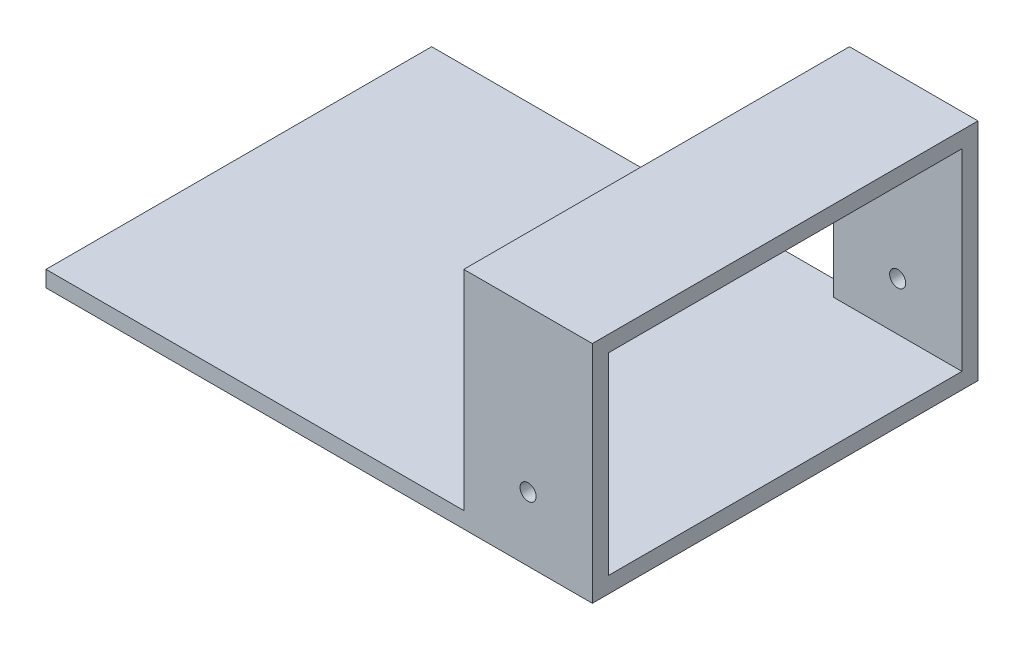
ISO-10303-21;
HEADER;
FILE_DESCRIPTION(('STEP AP214'),'2;1');
FILE_NAME('part.step','',(''),(''),'','','');
FILE_SCHEMA(('AUTOMOTIVE_DESIGN { 1 0 10303 214 1 1 1 1 }'));
ENDSEC;
DATA;
#1=APPLICATION_CONTEXT('core data for automotive mechanical design processes');
#2=APPLICATION_PROTOCOL_DEFINITION('international standard','automotive_design',2000,#1);
#3=PRODUCT_CONTEXT('',#1,'mechanical');
#4=PRODUCT('Part','Part','',(#3));
#5=PRODUCT_RELATED_PRODUCT_CATEGORY('part','',(#4));
#6=PRODUCT_DEFINITION_FORMATION('','',#4);
#7=PRODUCT_DEFINITION_CONTEXT('part definition',#1,'design');
#8=PRODUCT_DEFINITION('design','',#6,#7);
#9=PRODUCT_DEFINITION_SHAPE('','',#8);
#10=(LENGTH_UNIT() NAMED_UNIT(*) SI_UNIT(.MILLI.,.METRE.));
#11=(NAMED_UNIT(*) PLANE_ANGLE_UNIT() SI_UNIT($,.RADIAN.));
#12=(NAMED_UNIT(*) SI_UNIT($,.STERADIAN.) SOLID_ANGLE_UNIT());
#13=UNCERTAINTY_MEASURE_WITH_UNIT(LENGTH_MEASURE(1.E-05),#10,'distance_accuracy_value','');
#14=(GEOMETRIC_REPRESENTATION_CONTEXT(3) GLOBAL_UNCERTAINTY_ASSIGNED_CONTEXT((#13)) GLOBAL_UNIT_ASSIGNED_CONTEXT((#10,
#11,#12)) REPRESENTATION_CONTEXT('',''));
#15=CARTESIAN_POINT('',(0.,0.,0.));
#16=DIRECTION('',(0.,0.,1.));
#17=DIRECTION('',(1.,0.,0.));
#18=AXIS2_PLACEMENT_3D('',#15,#16,#17);
#19=CARTESIAN_POINT('',(-215.9,6.35,0.));
#20=DIRECTION('',(1.,0.,0.));
#21=DIRECTION('',(0.,0.,-1.));
#22=AXIS2_PLACEMENT_3D('',#19,#20,#21);
#23=PLANE('',#22);
#24=DIRECTION('',(0.,0.,1.));
#25=VECTOR('',#24,1.);
#26=CARTESIAN_POINT('',(-215.9,0.,0.));
#27=LINE('',#26,#25);
#28=CARTESIAN_POINT('',(-215.9,0.,-152.4));
#29=VERTEX_POINT('',#28);
#30=CARTESIAN_POINT('',(-215.9,0.,0.));
#31=VERTEX_POINT('',#30);
#32=EDGE_CURVE('E202',#29,#31,#27,.T.);
#33=ORIENTED_EDGE('',*,*,#32,.T.);
#34=DIRECTION('',(0.,-1.,0.));
#35=VECTOR('',#34,1.);
#36=CARTESIAN_POINT('',(-215.9,6.35,0.));
#37=LINE('',#36,#35);
#38=CARTESIAN_POINT('',(-215.9,6.35,0.));
#39=VERTEX_POINT('',#38);
#40=EDGE_CURVE('E11',#39,#31,#37,.T.);
#41=ORIENTED_EDGE('',*,*,#40,.F.);
#42=DIRECTION('',(0.,0.,1.));
#43=VECTOR('',#42,1.);
#44=CARTESIAN_POINT('',(-215.9,6.35,0.));
#45=LINE('',#44,#43);
#46=CARTESIAN_POINT('',(-215.9,6.35,-152.4));
#47=VERTEX_POINT('',#46);
#48=EDGE_CURVE('E203',#47,#39,#45,.T.);
#49=ORIENTED_EDGE('',*,*,#48,.F.);
#50=DIRECTION('',(0.,-1.,0.));
#51=VECTOR('',#50,1.);
#52=CARTESIAN_POINT('',(-215.9,6.35,-152.4));
#53=LINE('',#52,#51);
#54=EDGE_CURVE('E50',#47,#29,#53,.T.);
#55=ORIENTED_EDGE('',*,*,#54,.T.);
#56=EDGE_LOOP('',(#33,#41,#49,#55));
#57=FACE_BOUND('',#56,.T.);
#58=ADVANCED_FACE('F41',(#57),#23,.F.);
#59=CARTESIAN_POINT('',(0.,6.35,0.));
#60=DIRECTION('',(0.,0.,-1.));
#61=DIRECTION('',(-1.,0.,0.));
#62=AXIS2_PLACEMENT_3D('',#59,#60,#61);
#63=PLANE('',#62);
#64=CARTESIAN_POINT('',(-25.4,25.4,0.));
#65=DIRECTION('',(0.,0.,-1.));
#66=DIRECTION('',(-1.,0.,0.));
#67=AXIS2_PLACEMENT_3D('',#64,#65,#66);
#68=CIRCLE('',#67,3.17499999999996);
#69=CARTESIAN_POINT('',(-28.575,25.4,0.));
#70=VERTEX_POINT('',#69);
#71=EDGE_CURVE('E363',#70,#70,#68,.T.);
#72=ORIENTED_EDGE('',*,*,#71,.T.);
#73=EDGE_LOOP('',(#72));
#74=FACE_BOUND('',#73,.T.);
#75=DIRECTION('',(1.,0.,0.));
#76=VECTOR('',#75,1.);
#77=CARTESIAN_POINT('',(0.,0.,0.));
#78=LINE('',#77,#76);
#79=CARTESIAN_POINT('',(0.,0.,0.));
#80=VERTEX_POINT('',#79);
#81=EDGE_CURVE('E221',#31,#80,#78,.T.);
#82=ORIENTED_EDGE('',*,*,#81,.T.);
#83=DIRECTION('',(0.,-1.,0.));
#84=VECTOR('',#83,1.);
#85=CARTESIAN_POINT('',(0.,88.9,0.));
#86=LINE('',#85,#84);
#87=CARTESIAN_POINT('',(0.,88.9,0.));
#88=VERTEX_POINT('',#87);
#89=EDGE_CURVE('E194',#88,#80,#86,.T.);
#90=ORIENTED_EDGE('',*,*,#89,.F.);
#91=DIRECTION('',(-1.,0.,0.));
#92=VECTOR('',#91,1.);
#93=CARTESIAN_POINT('',(0.,88.9,0.));
#94=LINE('',#93,#92);
#95=CARTESIAN_POINT('',(-50.8,88.9,0.));
#96=VERTEX_POINT('',#95);
#97=EDGE_CURVE('E173',#88,#96,#94,.T.);
#98=ORIENTED_EDGE('',*,*,#97,.T.);
#99=DIRECTION('',(0.,-1.,0.));
#100=VECTOR('',#99,1.);
#101=CARTESIAN_POINT('',(-50.8,88.9,0.));
#102=LINE('',#101,#100);
#103=CARTESIAN_POINT('',(-50.8,6.34999999999999,0.));
#104=VERTEX_POINT('',#103);
#105=EDGE_CURVE('E198',#96,#104,#102,.T.);
#106=ORIENTED_EDGE('',*,*,#105,.T.);
#107=DIRECTION('',(1.,0.,0.));
#108=VECTOR('',#107,1.);
#109=CARTESIAN_POINT('',(0.,6.35,0.));
#110=LINE('',#109,#108);
#111=EDGE_CURVE('E206',#39,#104,#110,.T.);
#112=ORIENTED_EDGE('',*,*,#111,.F.);
#113=ORIENTED_EDGE('',*,*,#40,.T.);
#114=EDGE_LOOP('',(#82,#90,#98,#106,#112,#113));
#115=FACE_BOUND('',#114,.T.);
#116=ADVANCED_FACE('F239',(#74,#115),#63,.F.);
#117=CARTESIAN_POINT('',(0.,6.35,-152.4));
#118=DIRECTION('',(0.,0.,1.));
#119=DIRECTION('',(1.,0.,0.));
#120=AXIS2_PLACEMENT_3D('',#117,#118,#119);
#121=PLANE('',#120);
#122=CARTESIAN_POINT('',(-25.4,25.4,-152.4));
#123=DIRECTION('',(0.,0.,-1.));
#124=DIRECTION('',(-1.,0.,0.));
#125=AXIS2_PLACEMENT_3D('',#122,#123,#124);
#126=CIRCLE('',#125,3.17499999999998);
#127=CARTESIAN_POINT('',(-28.575,25.4,-152.4));
#128=VERTEX_POINT('',#127);
#129=EDGE_CURVE('E357',#128,#128,#126,.T.);
#130=ORIENTED_EDGE('',*,*,#129,.F.);
#131=EDGE_LOOP('',(#130));
#132=FACE_BOUND('',#131,.T.);
#133=DIRECTION('',(-1.,0.,0.));
#134=VECTOR('',#133,1.);
#135=CARTESIAN_POINT('',(0.,0.,-152.4));
#136=LINE('',#135,#134);
#137=CARTESIAN_POINT('',(0.,0.,-152.4));
#138=VERTEX_POINT('',#137);
#139=EDGE_CURVE('E207',#138,#29,#136,.T.);
#140=ORIENTED_EDGE('',*,*,#139,.T.);
#141=ORIENTED_EDGE('',*,*,#54,.F.);
#142=DIRECTION('',(-1.,0.,0.));
#143=VECTOR('',#142,1.);
#144=CARTESIAN_POINT('',(0.,6.35,-152.4));
#145=LINE('',#144,#143);
#146=CARTESIAN_POINT('',(-50.8,6.35,-152.4));
#147=VERTEX_POINT('',#146);
#148=EDGE_CURVE('E215',#147,#47,#145,.T.);
#149=ORIENTED_EDGE('',*,*,#148,.F.);
#150=DIRECTION('',(0.,-1.,0.));
#151=VECTOR('',#150,1.);
#152=CARTESIAN_POINT('',(-50.8,88.9,-152.4));
#153=LINE('',#152,#151);
#154=CARTESIAN_POINT('',(-50.8,88.9,-152.4));
#155=VERTEX_POINT('',#154);
#156=EDGE_CURVE('E183',#155,#147,#153,.T.);
#157=ORIENTED_EDGE('',*,*,#156,.F.);
#158=DIRECTION('',(-1.,0.,0.));
#159=VECTOR('',#158,1.);
#160=CARTESIAN_POINT('',(0.,88.9,-152.4));
#161=LINE('',#160,#159);
#162=CARTESIAN_POINT('',(0.,88.9,-152.4));
#163=VERTEX_POINT('',#162);
#164=EDGE_CURVE('E180',#163,#155,#161,.T.);
#165=ORIENTED_EDGE('',*,*,#164,.F.);
#166=DIRECTION('',(0.,-1.,0.));
#167=VECTOR('',#166,1.);
#168=CARTESIAN_POINT('',(0.,88.9,-152.4));
#169=LINE('',#168,#167);
#170=EDGE_CURVE('E190',#163,#138,#169,.T.);
#171=ORIENTED_EDGE('',*,*,#170,.T.);
#172=EDGE_LOOP('',(#140,#141,#149,#157,#165,#171));
#173=FACE_BOUND('',#172,.T.);
#174=ADVANCED_FACE('F241',(#132,#173),#121,.F.);
#175=CARTESIAN_POINT('',(0.,6.35,0.));
#176=DIRECTION('',(0.,1.,0.));
#177=DIRECTION('',(0.,0.,1.));
#178=AXIS2_PLACEMENT_3D('',#175,#176,#177);
#179=PLANE('',#178);
#180=ORIENTED_EDGE('',*,*,#48,.T.);
#181=ORIENTED_EDGE('',*,*,#111,.T.);
#182=DIRECTION('',(0.,0.,-1.));
#183=VECTOR('',#182,1.);
#184=CARTESIAN_POINT('',(-50.8,6.35,0.));
#185=LINE('',#184,#183);
#186=CARTESIAN_POINT('',(-50.8,6.35,-6.34999999999999));
#187=VERTEX_POINT('',#186);
#188=EDGE_CURVE('E212',#104,#187,#185,.T.);
#189=ORIENTED_EDGE('',*,*,#188,.T.);
#190=DIRECTION('',(-1.,0.,0.));
#191=VECTOR('',#190,1.);
#192=CARTESIAN_POINT('',(0.,6.35,-6.34999999999999));
#193=LINE('',#192,#191);
#194=CARTESIAN_POINT('',(0.,6.34999999999999,-6.34999999999999));
#195=VERTEX_POINT('',#194);
#196=EDGE_CURVE('E126',#195,#187,#193,.T.);
#197=ORIENTED_EDGE('',*,*,#196,.F.);
#198=DIRECTION('',(0.,0.,1.));
#199=VECTOR('',#198,1.);
#200=CARTESIAN_POINT('',(0.,6.35,-146.05));
#201=LINE('',#200,#199);
#202=CARTESIAN_POINT('',(0.,6.35,-146.05));
#203=VERTEX_POINT('',#202);
#204=EDGE_CURVE('E130',#203,#195,#201,.T.);
#205=ORIENTED_EDGE('',*,*,#204,.F.);
#206=DIRECTION('',(-1.,0.,0.));
#207=VECTOR('',#206,1.);
#208=CARTESIAN_POINT('',(0.,6.35,-146.05));
#209=LINE('',#208,#207);
#210=CARTESIAN_POINT('',(-50.8,6.35,-146.05));
#211=VERTEX_POINT('',#210);
#212=EDGE_CURVE('E117',#203,#211,#209,.T.);
#213=ORIENTED_EDGE('',*,*,#212,.T.);
#214=EDGE_CURVE('E211',#211,#147,#185,.T.);
#215=ORIENTED_EDGE('',*,*,#214,.T.);
#216=ORIENTED_EDGE('',*,*,#148,.T.);
#217=EDGE_LOOP('',(#180,#181,#189,#197,#205,#213,#215,#216));
#218=FACE_BOUND('',#217,.T.);
#219=ADVANCED_FACE('F132',(#218),#179,.T.);
#220=CARTESIAN_POINT('',(0.,0.,0.));
#221=DIRECTION('',(0.,1.,0.));
#222=DIRECTION('',(0.,0.,1.));
#223=AXIS2_PLACEMENT_3D('',#220,#221,#222);
#224=PLANE('',#223);
#225=ORIENTED_EDGE('',*,*,#32,.F.);
#226=ORIENTED_EDGE('',*,*,#139,.F.);
#227=DIRECTION('',(0.,0.,-1.));
#228=VECTOR('',#227,1.);
#229=CARTESIAN_POINT('',(0.,0.,0.));
#230=LINE('',#229,#228);
#231=EDGE_CURVE('E163',#80,#138,#230,.T.);
#232=ORIENTED_EDGE('',*,*,#231,.F.);
#233=ORIENTED_EDGE('',*,*,#81,.F.);
#234=EDGE_LOOP('',(#225,#226,#232,#233));
#235=FACE_BOUND('',#234,.T.);
#236=ADVANCED_FACE('F236',(#235),#224,.F.);
#237=CARTESIAN_POINT('',(-50.8,88.9,0.));
#238=DIRECTION('',(-1.,0.,0.));
#239=DIRECTION('',(0.,0.,1.));
#240=AXIS2_PLACEMENT_3D('',#237,#238,#239);
#241=PLANE('',#240);
#242=DIRECTION('',(0.,-1.,0.));
#243=VECTOR('',#242,1.);
#244=CARTESIAN_POINT('',(-50.8,82.55,-146.05));
#245=LINE('',#244,#243);
#246=CARTESIAN_POINT('',(-50.8,82.55,-146.05));
#247=VERTEX_POINT('',#246);
#248=EDGE_CURVE('E57',#247,#211,#245,.T.);
#249=ORIENTED_EDGE('',*,*,#248,.F.);
#250=DIRECTION('',(0.,0.,-1.));
#251=VECTOR('',#250,1.);
#252=CARTESIAN_POINT('',(-50.8,82.55,-146.05));
#253=LINE('',#252,#251);
#254=CARTESIAN_POINT('',(-50.8,82.55,-6.34999999999999));
#255=VERTEX_POINT('',#254);
#256=EDGE_CURVE('E141',#255,#247,#253,.T.);
#257=ORIENTED_EDGE('',*,*,#256,.F.);
#258=DIRECTION('',(0.,1.,0.));
#259=VECTOR('',#258,1.);
#260=CARTESIAN_POINT('',(-50.8,82.55,-6.34999999999999));
#261=LINE('',#260,#259);
#262=EDGE_CURVE('E145',#187,#255,#261,.T.);
#263=ORIENTED_EDGE('',*,*,#262,.F.);
#264=ORIENTED_EDGE('',*,*,#188,.F.);
#265=ORIENTED_EDGE('',*,*,#105,.F.);
#266=DIRECTION('',(0.,0.,-1.));
#267=VECTOR('',#266,1.);
#268=CARTESIAN_POINT('',(-50.8,88.9,0.));
#269=LINE('',#268,#267);
#270=EDGE_CURVE('E169',#96,#155,#269,.T.);
#271=ORIENTED_EDGE('',*,*,#270,.T.);
#272=ORIENTED_EDGE('',*,*,#156,.T.);
#273=ORIENTED_EDGE('',*,*,#214,.F.);
#274=EDGE_LOOP('',(#249,#257,#263,#264,#265,#271,#272,#273));
#275=FACE_BOUND('',#274,.T.);
#276=ADVANCED_FACE('F245',(#275),#241,.T.);
#277=CARTESIAN_POINT('',(0.,88.9,0.));
#278=DIRECTION('',(-1.,0.,0.));
#279=DIRECTION('',(0.,0.,1.));
#280=AXIS2_PLACEMENT_3D('',#277,#278,#279);
#281=PLANE('',#280);
#282=DIRECTION('',(0.,0.,-1.));
#283=VECTOR('',#282,1.);
#284=CARTESIAN_POINT('',(0.,82.55,-146.05));
#285=LINE('',#284,#283);
#286=CARTESIAN_POINT('',(0.,82.55,-6.34999999999999));
#287=VERTEX_POINT('',#286);
#288=CARTESIAN_POINT('',(0.,82.55,-146.05));
#289=VERTEX_POINT('',#288);
#290=EDGE_CURVE('E127',#287,#289,#285,.T.);
#291=ORIENTED_EDGE('',*,*,#290,.T.);
#292=DIRECTION('',(0.,-1.,0.));
#293=VECTOR('',#292,1.);
#294=CARTESIAN_POINT('',(0.,82.55,-146.05));
#295=LINE('',#294,#293);
#296=EDGE_CURVE('E121',#289,#203,#295,.T.);
#297=ORIENTED_EDGE('',*,*,#296,.T.);
#298=ORIENTED_EDGE('',*,*,#204,.T.);
#299=DIRECTION('',(0.,1.,0.));
#300=VECTOR('',#299,1.);
#301=CARTESIAN_POINT('',(0.,82.55,-6.34999999999999));
#302=LINE('',#301,#300);
#303=EDGE_CURVE('E65',#195,#287,#302,.T.);
#304=ORIENTED_EDGE('',*,*,#303,.T.);
#305=EDGE_LOOP('',(#291,#297,#298,#304));
#306=FACE_BOUND('',#305,.T.);
#307=ORIENTED_EDGE('',*,*,#231,.T.);
#308=ORIENTED_EDGE('',*,*,#170,.F.);
#309=DIRECTION('',(0.,0.,-1.));
#310=VECTOR('',#309,1.);
#311=CARTESIAN_POINT('',(0.,88.9,0.));
#312=LINE('',#311,#310);
#313=EDGE_CURVE('E177',#88,#163,#312,.T.);
#314=ORIENTED_EDGE('',*,*,#313,.F.);
#315=ORIENTED_EDGE('',*,*,#89,.T.);
#316=EDGE_LOOP('',(#307,#308,#314,#315));
#317=FACE_BOUND('',#316,.T.);
#318=ADVANCED_FACE('F137',(#306,#317),#281,.F.);
#319=CARTESIAN_POINT('',(0.,88.9,0.));
#320=DIRECTION('',(0.,1.,0.));
#321=DIRECTION('',(0.,0.,1.));
#322=AXIS2_PLACEMENT_3D('',#319,#320,#321);
#323=PLANE('',#322);
#324=ORIENTED_EDGE('',*,*,#270,.F.);
#325=ORIENTED_EDGE('',*,*,#97,.F.);
#326=ORIENTED_EDGE('',*,*,#313,.T.);
#327=ORIENTED_EDGE('',*,*,#164,.T.);
#328=EDGE_LOOP('',(#324,#325,#326,#327));
#329=FACE_BOUND('',#328,.T.);
#330=ADVANCED_FACE('F248',(#329),#323,.T.);
#331=CARTESIAN_POINT('',(0.,82.55,-146.05));
#332=DIRECTION('',(0.,0.,-1.));
#333=DIRECTION('',(-1.,0.,0.));
#334=AXIS2_PLACEMENT_3D('',#331,#332,#333);
#335=PLANE('',#334);
#336=CARTESIAN_POINT('',(-25.4,25.4,-146.05));
#337=DIRECTION('',(0.,0.,-1.));
#338=DIRECTION('',(-1.,0.,0.));
#339=AXIS2_PLACEMENT_3D('',#336,#337,#338);
#340=CIRCLE('',#339,3.17499999999997);
#341=CARTESIAN_POINT('',(-28.575,25.4,-146.05));
#342=VERTEX_POINT('',#341);
#343=EDGE_CURVE('E148',#342,#342,#340,.T.);
#344=ORIENTED_EDGE('',*,*,#343,.T.);
#345=EDGE_LOOP('',(#344));
#346=FACE_BOUND('',#345,.T.);
#347=ORIENTED_EDGE('',*,*,#248,.T.);
#348=ORIENTED_EDGE('',*,*,#212,.F.);
#349=ORIENTED_EDGE('',*,*,#296,.F.);
#350=DIRECTION('',(-1.,0.,0.));
#351=VECTOR('',#350,1.);
#352=CARTESIAN_POINT('',(0.,82.55,-146.05));
#353=LINE('',#352,#351);
#354=EDGE_CURVE('E160',#289,#247,#353,.T.);
#355=ORIENTED_EDGE('',*,*,#354,.T.);
#356=EDGE_LOOP('',(#347,#348,#349,#355));
#357=FACE_BOUND('',#356,.T.);
#358=ADVANCED_FACE('F119',(#346,#357),#335,.F.);
#359=CARTESIAN_POINT('',(0.,82.55,-146.05));
#360=DIRECTION('',(0.,1.,0.));
#361=DIRECTION('',(0.,0.,1.));
#362=AXIS2_PLACEMENT_3D('',#359,#360,#361);
#363=PLANE('',#362);
#364=ORIENTED_EDGE('',*,*,#256,.T.);
#365=ORIENTED_EDGE('',*,*,#354,.F.);
#366=ORIENTED_EDGE('',*,*,#290,.F.);
#367=DIRECTION('',(-1.,0.,0.));
#368=VECTOR('',#367,1.);
#369=CARTESIAN_POINT('',(0.,82.55,-6.34999999999999));
#370=LINE('',#369,#368);
#371=EDGE_CURVE('E164',#287,#255,#370,.T.);
#372=ORIENTED_EDGE('',*,*,#371,.T.);
#373=EDGE_LOOP('',(#364,#365,#366,#372));
#374=FACE_BOUND('',#373,.T.);
#375=ADVANCED_FACE('F297',(#374),#363,.F.);
#376=CARTESIAN_POINT('',(0.,82.55,-6.34999999999999));
#377=DIRECTION('',(0.,0.,1.));
#378=DIRECTION('',(1.,0.,0.));
#379=AXIS2_PLACEMENT_3D('',#376,#377,#378);
#380=PLANE('',#379);
#381=CARTESIAN_POINT('',(-25.4,25.4,-6.34999999999999));
#382=DIRECTION('',(0.,0.,1.));
#383=DIRECTION('',(1.,0.,0.));
#384=AXIS2_PLACEMENT_3D('',#381,#382,#383);
#385=CIRCLE('',#384,3.17499999999997);
#386=CARTESIAN_POINT('',(-22.225,25.4,-6.34999999999999));
#387=VERTEX_POINT('',#386);
#388=EDGE_CURVE('E44',#387,#387,#385,.T.);
#389=ORIENTED_EDGE('',*,*,#388,.T.);
#390=EDGE_LOOP('',(#389));
#391=FACE_BOUND('',#390,.T.);
#392=ORIENTED_EDGE('',*,*,#262,.T.);
#393=ORIENTED_EDGE('',*,*,#371,.F.);
#394=ORIENTED_EDGE('',*,*,#303,.F.);
#395=ORIENTED_EDGE('',*,*,#196,.T.);
#396=EDGE_LOOP('',(#392,#393,#394,#395));
#397=FACE_BOUND('',#396,.T.);
#398=ADVANCED_FACE('F301',(#391,#397),#380,.F.);
#399=CARTESIAN_POINT('',(-25.4,25.4,-152.4));
#400=DIRECTION('',(0.,0.,-1.));
#401=DIRECTION('',(-1.,0.,0.));
#402=AXIS2_PLACEMENT_3D('',#399,#400,#401);
#403=CYLINDRICAL_SURFACE('',#402,3.17499999999997);
#404=ORIENTED_EDGE('',*,*,#71,.F.);
#405=EDGE_LOOP('',(#404));
#406=FACE_BOUND('',#405,.T.);
#407=ORIENTED_EDGE('',*,*,#388,.F.);
#408=EDGE_LOOP('',(#407));
#409=FACE_BOUND('',#408,.T.);
#410=ADVANCED_FACE('F331',(#406,#409),#403,.F.);
#411=ORIENTED_EDGE('',*,*,#129,.T.);
#412=EDGE_LOOP('',(#411));
#413=FACE_BOUND('',#412,.T.);
#414=ORIENTED_EDGE('',*,*,#343,.F.);
#415=EDGE_LOOP('',(#414));
#416=FACE_BOUND('',#415,.T.);
#417=ADVANCED_FACE('F341',(#413,#416),#403,.F.);
#418=CLOSED_SHELL('',(#58,#116,#174,#219,#236,#276,#318,#330,#358,#375,#398,#410,#417));
#419=MANIFOLD_SOLID_BREP('B2',#418);
#420=ADVANCED_BREP_SHAPE_REPRESENTATION('',(#18,#419),#14);
#421=SHAPE_DEFINITION_REPRESENTATION(#9,#420);
ENDSEC;
END-ISO-10303-21;
